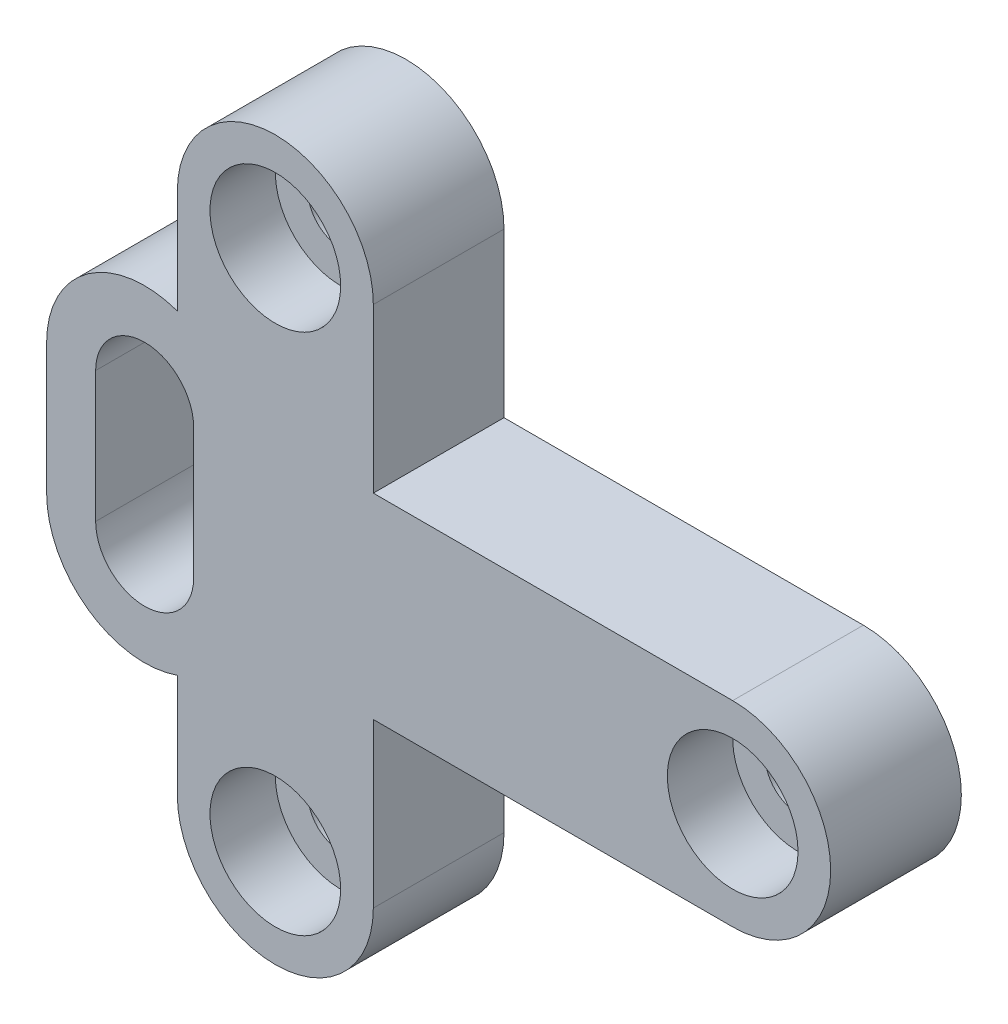
ISO-10303-21;
HEADER;
FILE_DESCRIPTION(('STEP AP214'),'2;1');
FILE_NAME('part.step','',(''),(''),'','','');
FILE_SCHEMA(('AUTOMOTIVE_DESIGN { 1 0 10303 214 1 1 1 1 }'));
ENDSEC;
DATA;
#1=APPLICATION_CONTEXT('core data for automotive mechanical design processes');
#2=APPLICATION_PROTOCOL_DEFINITION('international standard','automotive_design',2000,#1);
#3=PRODUCT_CONTEXT('',#1,'mechanical');
#4=PRODUCT('Part','Part','',(#3));
#5=PRODUCT_RELATED_PRODUCT_CATEGORY('part','',(#4));
#6=PRODUCT_DEFINITION_FORMATION('','',#4);
#7=PRODUCT_DEFINITION_CONTEXT('part definition',#1,'design');
#8=PRODUCT_DEFINITION('design','',#6,#7);
#9=PRODUCT_DEFINITION_SHAPE('','',#8);
#10=(LENGTH_UNIT() NAMED_UNIT(*) SI_UNIT(.MILLI.,.METRE.));
#11=(NAMED_UNIT(*) PLANE_ANGLE_UNIT() SI_UNIT($,.RADIAN.));
#12=(NAMED_UNIT(*) SI_UNIT($,.STERADIAN.) SOLID_ANGLE_UNIT());
#13=UNCERTAINTY_MEASURE_WITH_UNIT(LENGTH_MEASURE(1.E-05),#10,'distance_accuracy_value','');
#14=(GEOMETRIC_REPRESENTATION_CONTEXT(3) GLOBAL_UNCERTAINTY_ASSIGNED_CONTEXT((#13)) GLOBAL_UNIT_ASSIGNED_CONTEXT((#10,
#11,#12)) REPRESENTATION_CONTEXT('',''));
#15=CARTESIAN_POINT('',(0.,0.,0.));
#16=DIRECTION('',(0.,0.,1.));
#17=DIRECTION('',(1.,0.,0.));
#18=AXIS2_PLACEMENT_3D('',#15,#16,#17);
#19=CARTESIAN_POINT('',(20.,40.,20.));
#20=DIRECTION('',(0.,0.,-1.));
#21=DIRECTION('',(-1.,0.,0.));
#22=AXIS2_PLACEMENT_3D('',#19,#20,#21);
#23=CYLINDRICAL_SURFACE('',#22,5.);
#24=CARTESIAN_POINT('',(20.,40.,0.));
#25=DIRECTION('',(0.,0.,1.));
#26=DIRECTION('',(1.,0.,0.));
#27=AXIS2_PLACEMENT_3D('',#24,#25,#26);
#28=CIRCLE('',#27,5.);
#29=CARTESIAN_POINT('',(25.,40.,0.));
#30=VERTEX_POINT('',#29);
#31=EDGE_CURVE('E193',#30,#30,#28,.T.);
#32=ORIENTED_EDGE('',*,*,#31,.F.);
#33=EDGE_LOOP('',(#32));
#34=FACE_BOUND('',#33,.T.);
#35=CARTESIAN_POINT('',(20.,40.,10.));
#36=DIRECTION('',(0.,0.,1.));
#37=DIRECTION('',(1.,0.,0.));
#38=AXIS2_PLACEMENT_3D('',#35,#36,#37);
#39=CIRCLE('',#38,5.);
#40=CARTESIAN_POINT('',(25.,40.,10.));
#41=VERTEX_POINT('',#40);
#42=EDGE_CURVE('E45',#41,#41,#39,.T.);
#43=ORIENTED_EDGE('',*,*,#42,.T.);
#44=EDGE_LOOP('',(#43));
#45=FACE_BOUND('',#44,.T.);
#46=ADVANCED_FACE('F41',(#34,#45),#23,.F.);
#47=CARTESIAN_POINT('',(20.,-40.,20.));
#48=DIRECTION('',(0.,0.,-1.));
#49=DIRECTION('',(-1.,0.,0.));
#50=AXIS2_PLACEMENT_3D('',#47,#48,#49);
#51=CYLINDRICAL_SURFACE('',#50,5.);
#52=CARTESIAN_POINT('',(20.,-40.,0.));
#53=DIRECTION('',(0.,0.,1.));
#54=DIRECTION('',(1.,0.,0.));
#55=AXIS2_PLACEMENT_3D('',#52,#53,#54);
#56=CIRCLE('',#55,5.);
#57=CARTESIAN_POINT('',(25.,-40.,0.));
#58=VERTEX_POINT('',#57);
#59=EDGE_CURVE('E341',#58,#58,#56,.T.);
#60=ORIENTED_EDGE('',*,*,#59,.F.);
#61=EDGE_LOOP('',(#60));
#62=FACE_BOUND('',#61,.T.);
#63=CARTESIAN_POINT('',(20.,-40.,10.));
#64=DIRECTION('',(0.,0.,1.));
#65=DIRECTION('',(1.,0.,0.));
#66=AXIS2_PLACEMENT_3D('',#63,#64,#65);
#67=CIRCLE('',#66,5.);
#68=CARTESIAN_POINT('',(25.,-40.,10.));
#69=VERTEX_POINT('',#68);
#70=EDGE_CURVE('E328',#69,#69,#67,.T.);
#71=ORIENTED_EDGE('',*,*,#70,.T.);
#72=EDGE_LOOP('',(#71));
#73=FACE_BOUND('',#72,.T.);
#74=ADVANCED_FACE('F359',(#62,#73),#51,.F.);
#75=CARTESIAN_POINT('',(90.,0.,20.));
#76=DIRECTION('',(0.,0.,-1.));
#77=DIRECTION('',(-1.,0.,0.));
#78=AXIS2_PLACEMENT_3D('',#75,#76,#77);
#79=CYLINDRICAL_SURFACE('',#78,5.);
#80=CARTESIAN_POINT('',(90.,0.,0.));
#81=DIRECTION('',(0.,0.,1.));
#82=DIRECTION('',(1.,0.,0.));
#83=AXIS2_PLACEMENT_3D('',#80,#81,#82);
#84=CIRCLE('',#83,5.);
#85=CARTESIAN_POINT('',(95.,0.,0.));
#86=VERTEX_POINT('',#85);
#87=EDGE_CURVE('E336',#86,#86,#84,.T.);
#88=ORIENTED_EDGE('',*,*,#87,.F.);
#89=EDGE_LOOP('',(#88));
#90=FACE_BOUND('',#89,.T.);
#91=CARTESIAN_POINT('',(90.,0.,10.));
#92=DIRECTION('',(0.,0.,1.));
#93=DIRECTION('',(1.,0.,0.));
#94=AXIS2_PLACEMENT_3D('',#91,#92,#93);
#95=CIRCLE('',#94,5.);
#96=CARTESIAN_POINT('',(95.,0.,10.));
#97=VERTEX_POINT('',#96);
#98=EDGE_CURVE('E325',#97,#97,#95,.T.);
#99=ORIENTED_EDGE('',*,*,#98,.T.);
#100=EDGE_LOOP('',(#99));
#101=FACE_BOUND('',#100,.T.);
#102=ADVANCED_FACE('F364',(#90,#101),#79,.F.);
#103=CARTESIAN_POINT('',(0.,10.,20.));
#104=DIRECTION('',(0.,0.,1.));
#105=DIRECTION('',(1.,0.,0.));
#106=AXIS2_PLACEMENT_3D('',#103,#104,#105);
#107=PLANE('',#106);
#108=CARTESIAN_POINT('',(20.,40.,20.));
#109=DIRECTION('',(0.,0.,1.));
#110=DIRECTION('',(1.,0.,0.));
#111=AXIS2_PLACEMENT_3D('',#108,#109,#110);
#112=CIRCLE('',#111,10.);
#113=CARTESIAN_POINT('',(30.,40.,20.));
#114=VERTEX_POINT('',#113);
#115=EDGE_CURVE('E693',#114,#114,#112,.T.);
#116=ORIENTED_EDGE('',*,*,#115,.F.);
#117=EDGE_LOOP('',(#116));
#118=FACE_BOUND('',#117,.T.);
#119=CARTESIAN_POINT('',(20.,-40.,20.));
#120=DIRECTION('',(0.,0.,1.));
#121=DIRECTION('',(1.,0.,0.));
#122=AXIS2_PLACEMENT_3D('',#119,#120,#121);
#123=CIRCLE('',#122,10.);
#124=CARTESIAN_POINT('',(30.,-40.,20.));
#125=VERTEX_POINT('',#124);
#126=EDGE_CURVE('E703',#125,#125,#123,.T.);
#127=ORIENTED_EDGE('',*,*,#126,.F.);
#128=EDGE_LOOP('',(#127));
#129=FACE_BOUND('',#128,.T.);
#130=CARTESIAN_POINT('',(90.,0.,20.));
#131=DIRECTION('',(0.,0.,1.));
#132=DIRECTION('',(1.,0.,0.));
#133=AXIS2_PLACEMENT_3D('',#130,#131,#132);
#134=CIRCLE('',#133,9.99999999999999);
#135=CARTESIAN_POINT('',(100.,0.,20.));
#136=VERTEX_POINT('',#135);
#137=EDGE_CURVE('E349',#136,#136,#134,.T.);
#138=ORIENTED_EDGE('',*,*,#137,.F.);
#139=EDGE_LOOP('',(#138));
#140=FACE_BOUND('',#139,.T.);
#141=DIRECTION('',(0.,-1.,0.));
#142=VECTOR('',#141,1.);
#143=CARTESIAN_POINT('',(-7.5,10.,20.));
#144=LINE('',#143,#142);
#145=CARTESIAN_POINT('',(-7.5,10.,20.));
#146=VERTEX_POINT('',#145);
#147=CARTESIAN_POINT('',(-7.49999999999999,-10.,20.));
#148=VERTEX_POINT('',#147);
#149=EDGE_CURVE('E166',#146,#148,#144,.T.);
#150=ORIENTED_EDGE('',*,*,#149,.F.);
#151=CARTESIAN_POINT('',(0.,10.,20.));
#152=DIRECTION('',(0.,0.,1.));
#153=DIRECTION('',(1.,0.,0.));
#154=AXIS2_PLACEMENT_3D('',#151,#152,#153);
#155=CIRCLE('',#154,7.5);
#156=CARTESIAN_POINT('',(7.49999999999999,10.,20.));
#157=VERTEX_POINT('',#156);
#158=EDGE_CURVE('E157',#157,#146,#155,.T.);
#159=ORIENTED_EDGE('',*,*,#158,.F.);
#160=DIRECTION('',(0.,1.,0.));
#161=VECTOR('',#160,1.);
#162=CARTESIAN_POINT('',(7.49999999999999,10.,20.));
#163=LINE('',#162,#161);
#164=CARTESIAN_POINT('',(7.5,-10.,20.));
#165=VERTEX_POINT('',#164);
#166=EDGE_CURVE('E185',#165,#157,#163,.T.);
#167=ORIENTED_EDGE('',*,*,#166,.F.);
#168=CARTESIAN_POINT('',(0.,-10.,20.));
#169=DIRECTION('',(0.,0.,1.));
#170=DIRECTION('',(1.,0.,0.));
#171=AXIS2_PLACEMENT_3D('',#168,#169,#170);
#172=CIRCLE('',#171,7.5);
#173=EDGE_CURVE('E181',#148,#165,#172,.T.);
#174=ORIENTED_EDGE('',*,*,#173,.F.);
#175=EDGE_LOOP('',(#150,#159,#167,#174));
#176=FACE_BOUND('',#175,.T.);
#177=CARTESIAN_POINT('',(0.,10.,20.));
#178=DIRECTION('',(0.,0.,1.));
#179=DIRECTION('',(1.,0.,0.));
#180=AXIS2_PLACEMENT_3D('',#177,#178,#179);
#181=CIRCLE('',#180,15.);
#182=CARTESIAN_POINT('',(4.99999999999997,24.142135623731,20.));
#183=VERTEX_POINT('',#182);
#184=CARTESIAN_POINT('',(-15.,9.99999999999999,20.));
#185=VERTEX_POINT('',#184);
#186=EDGE_CURVE('E209',#183,#185,#181,.T.);
#187=ORIENTED_EDGE('',*,*,#186,.T.);
#188=DIRECTION('',(0.,-1.,0.));
#189=VECTOR('',#188,1.);
#190=CARTESIAN_POINT('',(-15.,9.99999999999999,20.));
#191=LINE('',#190,#189);
#192=CARTESIAN_POINT('',(-15.,-10.,20.));
#193=VERTEX_POINT('',#192);
#194=EDGE_CURVE('E213',#185,#193,#191,.T.);
#195=ORIENTED_EDGE('',*,*,#194,.T.);
#196=CARTESIAN_POINT('',(0.,-10.,20.));
#197=DIRECTION('',(0.,0.,1.));
#198=DIRECTION('',(1.,0.,0.));
#199=AXIS2_PLACEMENT_3D('',#196,#197,#198);
#200=CIRCLE('',#199,15.);
#201=CARTESIAN_POINT('',(4.99999999999998,-24.142135623731,20.));
#202=VERTEX_POINT('',#201);
#203=EDGE_CURVE('E217',#193,#202,#200,.T.);
#204=ORIENTED_EDGE('',*,*,#203,.T.);
#205=DIRECTION('',(0.,-1.,0.));
#206=VECTOR('',#205,1.);
#207=CARTESIAN_POINT('',(4.99999999999999,-24.142135623731,20.));
#208=LINE('',#207,#206);
#209=CARTESIAN_POINT('',(4.99999999999999,-40.,20.));
#210=VERTEX_POINT('',#209);
#211=EDGE_CURVE('E220',#202,#210,#208,.T.);
#212=ORIENTED_EDGE('',*,*,#211,.T.);
#213=CARTESIAN_POINT('',(20.,-40.,20.));
#214=DIRECTION('',(0.,0.,1.));
#215=DIRECTION('',(1.,0.,0.));
#216=AXIS2_PLACEMENT_3D('',#213,#214,#215);
#217=CIRCLE('',#216,15.);
#218=CARTESIAN_POINT('',(35.,-40.,20.));
#219=VERTEX_POINT('',#218);
#220=EDGE_CURVE('E223',#210,#219,#217,.T.);
#221=ORIENTED_EDGE('',*,*,#220,.T.);
#222=DIRECTION('',(0.,1.,0.));
#223=VECTOR('',#222,1.);
#224=CARTESIAN_POINT('',(35.,-15.,20.));
#225=LINE('',#224,#223);
#226=CARTESIAN_POINT('',(35.,-15.,20.));
#227=VERTEX_POINT('',#226);
#228=EDGE_CURVE('E226',#219,#227,#225,.T.);
#229=ORIENTED_EDGE('',*,*,#228,.T.);
#230=DIRECTION('',(1.,0.,0.));
#231=VECTOR('',#230,1.);
#232=CARTESIAN_POINT('',(35.,-15.,20.));
#233=LINE('',#232,#231);
#234=CARTESIAN_POINT('',(90.,-15.,20.));
#235=VERTEX_POINT('',#234);
#236=EDGE_CURVE('E229',#227,#235,#233,.T.);
#237=ORIENTED_EDGE('',*,*,#236,.T.);
#238=CARTESIAN_POINT('',(90.,0.,20.));
#239=DIRECTION('',(0.,0.,1.));
#240=DIRECTION('',(1.,0.,0.));
#241=AXIS2_PLACEMENT_3D('',#238,#239,#240);
#242=CIRCLE('',#241,15.);
#243=CARTESIAN_POINT('',(90.,15.,20.));
#244=VERTEX_POINT('',#243);
#245=EDGE_CURVE('E232',#235,#244,#242,.T.);
#246=ORIENTED_EDGE('',*,*,#245,.T.);
#247=DIRECTION('',(-1.,0.,0.));
#248=VECTOR('',#247,1.);
#249=CARTESIAN_POINT('',(35.,15.,20.));
#250=LINE('',#249,#248);
#251=CARTESIAN_POINT('',(35.,15.,20.));
#252=VERTEX_POINT('',#251);
#253=EDGE_CURVE('E235',#244,#252,#250,.T.);
#254=ORIENTED_EDGE('',*,*,#253,.T.);
#255=DIRECTION('',(0.,1.,0.));
#256=VECTOR('',#255,1.);
#257=CARTESIAN_POINT('',(35.,40.,20.));
#258=LINE('',#257,#256);
#259=CARTESIAN_POINT('',(35.,40.,20.));
#260=VERTEX_POINT('',#259);
#261=EDGE_CURVE('E238',#252,#260,#258,.T.);
#262=ORIENTED_EDGE('',*,*,#261,.T.);
#263=CARTESIAN_POINT('',(20.,40.,20.));
#264=DIRECTION('',(0.,0.,1.));
#265=DIRECTION('',(1.,0.,0.));
#266=AXIS2_PLACEMENT_3D('',#263,#264,#265);
#267=CIRCLE('',#266,15.);
#268=CARTESIAN_POINT('',(4.99999999999997,40.,20.));
#269=VERTEX_POINT('',#268);
#270=EDGE_CURVE('E241',#260,#269,#267,.T.);
#271=ORIENTED_EDGE('',*,*,#270,.T.);
#272=DIRECTION('',(0.,-1.,0.));
#273=VECTOR('',#272,1.);
#274=CARTESIAN_POINT('',(4.99999999999997,40.,20.));
#275=LINE('',#274,#273);
#276=EDGE_CURVE('E244',#269,#183,#275,.T.);
#277=ORIENTED_EDGE('',*,*,#276,.T.);
#278=EDGE_LOOP('',(#187,#195,#204,#212,#221,#229,#237,#246,#254,#262,#271,#277));
#279=FACE_BOUND('',#278,.T.);
#280=ADVANCED_FACE('F179',(#118,#129,#140,#176,#279),#107,.T.);
#281=CARTESIAN_POINT('',(0.,10.,0.));
#282=DIRECTION('',(0.,0.,1.));
#283=DIRECTION('',(1.,0.,0.));
#284=AXIS2_PLACEMENT_3D('',#281,#282,#283);
#285=PLANE('',#284);
#286=CARTESIAN_POINT('',(0.,10.,0.));
#287=DIRECTION('',(0.,0.,1.));
#288=DIRECTION('',(1.,0.,0.));
#289=AXIS2_PLACEMENT_3D('',#286,#287,#288);
#290=CIRCLE('',#289,15.);
#291=CARTESIAN_POINT('',(4.99999999999997,24.142135623731,0.));
#292=VERTEX_POINT('',#291);
#293=CARTESIAN_POINT('',(-15.,9.99999999999999,0.));
#294=VERTEX_POINT('',#293);
#295=EDGE_CURVE('E175',#292,#294,#290,.T.);
#296=ORIENTED_EDGE('',*,*,#295,.F.);
#297=DIRECTION('',(0.,-1.,0.));
#298=VECTOR('',#297,1.);
#299=CARTESIAN_POINT('',(4.99999999999997,40.,0.));
#300=LINE('',#299,#298);
#301=CARTESIAN_POINT('',(4.99999999999997,40.,0.));
#302=VERTEX_POINT('',#301);
#303=EDGE_CURVE('E214',#302,#292,#300,.T.);
#304=ORIENTED_EDGE('',*,*,#303,.F.);
#305=CARTESIAN_POINT('',(20.,40.,0.));
#306=DIRECTION('',(0.,0.,1.));
#307=DIRECTION('',(1.,0.,0.));
#308=AXIS2_PLACEMENT_3D('',#305,#306,#307);
#309=CIRCLE('',#308,15.);
#310=CARTESIAN_POINT('',(35.,40.,0.));
#311=VERTEX_POINT('',#310);
#312=EDGE_CURVE('E278',#311,#302,#309,.T.);
#313=ORIENTED_EDGE('',*,*,#312,.F.);
#314=DIRECTION('',(0.,1.,0.));
#315=VECTOR('',#314,1.);
#316=CARTESIAN_POINT('',(35.,40.,0.));
#317=LINE('',#316,#315);
#318=CARTESIAN_POINT('',(35.,15.,0.));
#319=VERTEX_POINT('',#318);
#320=EDGE_CURVE('E275',#319,#311,#317,.T.);
#321=ORIENTED_EDGE('',*,*,#320,.F.);
#322=DIRECTION('',(-1.,0.,0.));
#323=VECTOR('',#322,1.);
#324=CARTESIAN_POINT('',(35.,15.,0.));
#325=LINE('',#324,#323);
#326=CARTESIAN_POINT('',(90.,15.,0.));
#327=VERTEX_POINT('',#326);
#328=EDGE_CURVE('E272',#327,#319,#325,.T.);
#329=ORIENTED_EDGE('',*,*,#328,.F.);
#330=CARTESIAN_POINT('',(90.,0.,0.));
#331=DIRECTION('',(0.,0.,1.));
#332=DIRECTION('',(1.,0.,0.));
#333=AXIS2_PLACEMENT_3D('',#330,#331,#332);
#334=CIRCLE('',#333,15.);
#335=CARTESIAN_POINT('',(90.,-15.,0.));
#336=VERTEX_POINT('',#335);
#337=EDGE_CURVE('E269',#336,#327,#334,.T.);
#338=ORIENTED_EDGE('',*,*,#337,.F.);
#339=DIRECTION('',(1.,0.,0.));
#340=VECTOR('',#339,1.);
#341=CARTESIAN_POINT('',(35.,-15.,0.));
#342=LINE('',#341,#340);
#343=CARTESIAN_POINT('',(35.,-15.,0.));
#344=VERTEX_POINT('',#343);
#345=EDGE_CURVE('E266',#344,#336,#342,.T.);
#346=ORIENTED_EDGE('',*,*,#345,.F.);
#347=DIRECTION('',(0.,1.,0.));
#348=VECTOR('',#347,1.);
#349=CARTESIAN_POINT('',(35.,-15.,0.));
#350=LINE('',#349,#348);
#351=CARTESIAN_POINT('',(35.,-40.,0.));
#352=VERTEX_POINT('',#351);
#353=EDGE_CURVE('E263',#352,#344,#350,.T.);
#354=ORIENTED_EDGE('',*,*,#353,.F.);
#355=CARTESIAN_POINT('',(20.,-40.,0.));
#356=DIRECTION('',(0.,0.,1.));
#357=DIRECTION('',(1.,0.,0.));
#358=AXIS2_PLACEMENT_3D('',#355,#356,#357);
#359=CIRCLE('',#358,15.);
#360=CARTESIAN_POINT('',(4.99999999999999,-40.,0.));
#361=VERTEX_POINT('',#360);
#362=EDGE_CURVE('E260',#361,#352,#359,.T.);
#363=ORIENTED_EDGE('',*,*,#362,.F.);
#364=DIRECTION('',(0.,-1.,0.));
#365=VECTOR('',#364,1.);
#366=CARTESIAN_POINT('',(4.99999999999999,-24.142135623731,0.));
#367=LINE('',#366,#365);
#368=CARTESIAN_POINT('',(4.99999999999998,-24.142135623731,0.));
#369=VERTEX_POINT('',#368);
#370=EDGE_CURVE('E257',#369,#361,#367,.T.);
#371=ORIENTED_EDGE('',*,*,#370,.F.);
#372=CARTESIAN_POINT('',(0.,-10.,0.));
#373=DIRECTION('',(0.,0.,1.));
#374=DIRECTION('',(1.,0.,0.));
#375=AXIS2_PLACEMENT_3D('',#372,#373,#374);
#376=CIRCLE('',#375,15.);
#377=CARTESIAN_POINT('',(-15.,-10.,0.));
#378=VERTEX_POINT('',#377);
#379=EDGE_CURVE('E254',#378,#369,#376,.T.);
#380=ORIENTED_EDGE('',*,*,#379,.F.);
#381=DIRECTION('',(0.,-1.,0.));
#382=VECTOR('',#381,1.);
#383=CARTESIAN_POINT('',(-15.,9.99999999999999,0.));
#384=LINE('',#383,#382);
#385=EDGE_CURVE('E251',#294,#378,#384,.T.);
#386=ORIENTED_EDGE('',*,*,#385,.F.);
#387=EDGE_LOOP('',(#296,#304,#313,#321,#329,#338,#346,#354,#363,#371,#380,#386));
#388=FACE_BOUND('',#387,.T.);
#389=CARTESIAN_POINT('',(0.,10.,0.));
#390=DIRECTION('',(0.,0.,1.));
#391=DIRECTION('',(1.,0.,0.));
#392=AXIS2_PLACEMENT_3D('',#389,#390,#391);
#393=CIRCLE('',#392,7.5);
#394=CARTESIAN_POINT('',(7.49999999999999,10.,0.));
#395=VERTEX_POINT('',#394);
#396=CARTESIAN_POINT('',(-7.5,10.,0.));
#397=VERTEX_POINT('',#396);
#398=EDGE_CURVE('E67',#395,#397,#393,.T.);
#399=ORIENTED_EDGE('',*,*,#398,.T.);
#400=DIRECTION('',(0.,-1.,0.));
#401=VECTOR('',#400,1.);
#402=CARTESIAN_POINT('',(-7.5,10.,0.));
#403=LINE('',#402,#401);
#404=CARTESIAN_POINT('',(-7.49999999999999,-10.,0.));
#405=VERTEX_POINT('',#404);
#406=EDGE_CURVE('E173',#397,#405,#403,.T.);
#407=ORIENTED_EDGE('',*,*,#406,.T.);
#408=CARTESIAN_POINT('',(0.,-10.,0.));
#409=DIRECTION('',(0.,0.,1.));
#410=DIRECTION('',(1.,0.,0.));
#411=AXIS2_PLACEMENT_3D('',#408,#409,#410);
#412=CIRCLE('',#411,7.5);
#413=CARTESIAN_POINT('',(7.5,-10.,0.));
#414=VERTEX_POINT('',#413);
#415=EDGE_CURVE('E196',#405,#414,#412,.T.);
#416=ORIENTED_EDGE('',*,*,#415,.T.);
#417=DIRECTION('',(0.,1.,0.));
#418=VECTOR('',#417,1.);
#419=CARTESIAN_POINT('',(7.49999999999999,10.,0.));
#420=LINE('',#419,#418);
#421=EDGE_CURVE('E167',#414,#395,#420,.T.);
#422=ORIENTED_EDGE('',*,*,#421,.T.);
#423=EDGE_LOOP('',(#399,#407,#416,#422));
#424=FACE_BOUND('',#423,.T.);
#425=ORIENTED_EDGE('',*,*,#31,.T.);
#426=EDGE_LOOP('',(#425));
#427=FACE_BOUND('',#426,.T.);
#428=ORIENTED_EDGE('',*,*,#59,.T.);
#429=EDGE_LOOP('',(#428));
#430=FACE_BOUND('',#429,.T.);
#431=ORIENTED_EDGE('',*,*,#87,.T.);
#432=EDGE_LOOP('',(#431));
#433=FACE_BOUND('',#432,.T.);
#434=ADVANCED_FACE('F355',(#388,#424,#427,#430,#433),#285,.F.);
#435=CARTESIAN_POINT('',(0.,10.,20.));
#436=DIRECTION('',(0.,0.,-1.));
#437=DIRECTION('',(-1.,0.,0.));
#438=AXIS2_PLACEMENT_3D('',#435,#436,#437);
#439=CYLINDRICAL_SURFACE('',#438,15.);
#440=ORIENTED_EDGE('',*,*,#295,.T.);
#441=DIRECTION('',(0.,0.,-1.));
#442=VECTOR('',#441,1.);
#443=CARTESIAN_POINT('',(-15.,9.99999999999999,20.));
#444=LINE('',#443,#442);
#445=EDGE_CURVE('E11',#185,#294,#444,.T.);
#446=ORIENTED_EDGE('',*,*,#445,.F.);
#447=ORIENTED_EDGE('',*,*,#186,.F.);
#448=DIRECTION('',(0.,0.,-1.));
#449=VECTOR('',#448,1.);
#450=CARTESIAN_POINT('',(4.99999999999997,24.142135623731,20.));
#451=LINE('',#450,#449);
#452=EDGE_CURVE('E247',#183,#292,#451,.T.);
#453=ORIENTED_EDGE('',*,*,#452,.T.);
#454=EDGE_LOOP('',(#440,#446,#447,#453));
#455=FACE_BOUND('',#454,.T.);
#456=ADVANCED_FACE('F43',(#455),#439,.T.);
#457=CARTESIAN_POINT('',(-15.,9.99999999999999,20.));
#458=DIRECTION('',(1.,0.,0.));
#459=DIRECTION('',(0.,1.,0.));
#460=AXIS2_PLACEMENT_3D('',#457,#458,#459);
#461=PLANE('',#460);
#462=ORIENTED_EDGE('',*,*,#385,.T.);
#463=DIRECTION('',(0.,0.,-1.));
#464=VECTOR('',#463,1.);
#465=CARTESIAN_POINT('',(-15.,-10.,20.));
#466=LINE('',#465,#464);
#467=EDGE_CURVE('E51',#193,#378,#466,.T.);
#468=ORIENTED_EDGE('',*,*,#467,.F.);
#469=ORIENTED_EDGE('',*,*,#194,.F.);
#470=ORIENTED_EDGE('',*,*,#445,.T.);
#471=EDGE_LOOP('',(#462,#468,#469,#470));
#472=FACE_BOUND('',#471,.T.);
#473=ADVANCED_FACE('F425',(#472),#461,.F.);
#474=CARTESIAN_POINT('',(0.,-10.,20.));
#475=DIRECTION('',(0.,0.,-1.));
#476=DIRECTION('',(-1.,0.,0.));
#477=AXIS2_PLACEMENT_3D('',#474,#475,#476);
#478=CYLINDRICAL_SURFACE('',#477,15.);
#479=ORIENTED_EDGE('',*,*,#379,.T.);
#480=DIRECTION('',(0.,0.,-1.));
#481=VECTOR('',#480,1.);
#482=CARTESIAN_POINT('',(4.99999999999998,-24.142135623731,20.));
#483=LINE('',#482,#481);
#484=EDGE_CURVE('E318',#202,#369,#483,.T.);
#485=ORIENTED_EDGE('',*,*,#484,.F.);
#486=ORIENTED_EDGE('',*,*,#203,.F.);
#487=ORIENTED_EDGE('',*,*,#467,.T.);
#488=EDGE_LOOP('',(#479,#485,#486,#487));
#489=FACE_BOUND('',#488,.T.);
#490=ADVANCED_FACE('F422',(#489),#478,.T.);
#491=CARTESIAN_POINT('',(4.99999999999999,-24.142135623731,20.));
#492=DIRECTION('',(1.,0.,0.));
#493=DIRECTION('',(0.,1.,0.));
#494=AXIS2_PLACEMENT_3D('',#491,#492,#493);
#495=PLANE('',#494);
#496=ORIENTED_EDGE('',*,*,#370,.T.);
#497=DIRECTION('',(0.,0.,-1.));
#498=VECTOR('',#497,1.);
#499=CARTESIAN_POINT('',(4.99999999999999,-40.,20.));
#500=LINE('',#499,#498);
#501=EDGE_CURVE('E314',#210,#361,#500,.T.);
#502=ORIENTED_EDGE('',*,*,#501,.F.);
#503=ORIENTED_EDGE('',*,*,#211,.F.);
#504=ORIENTED_EDGE('',*,*,#484,.T.);
#505=EDGE_LOOP('',(#496,#502,#503,#504));
#506=FACE_BOUND('',#505,.T.);
#507=ADVANCED_FACE('F418',(#506),#495,.F.);
#508=CARTESIAN_POINT('',(20.,-40.,20.));
#509=DIRECTION('',(0.,0.,-1.));
#510=DIRECTION('',(-1.,0.,0.));
#511=AXIS2_PLACEMENT_3D('',#508,#509,#510);
#512=CYLINDRICAL_SURFACE('',#511,15.);
#513=ORIENTED_EDGE('',*,*,#362,.T.);
#514=DIRECTION('',(0.,0.,-1.));
#515=VECTOR('',#514,1.);
#516=CARTESIAN_POINT('',(35.,-40.,20.));
#517=LINE('',#516,#515);
#518=EDGE_CURVE('E310',#219,#352,#517,.T.);
#519=ORIENTED_EDGE('',*,*,#518,.F.);
#520=ORIENTED_EDGE('',*,*,#220,.F.);
#521=ORIENTED_EDGE('',*,*,#501,.T.);
#522=EDGE_LOOP('',(#513,#519,#520,#521));
#523=FACE_BOUND('',#522,.T.);
#524=ADVANCED_FACE('F414',(#523),#512,.T.);
#525=CARTESIAN_POINT('',(35.,-15.,20.));
#526=DIRECTION('',(-1.,0.,0.));
#527=DIRECTION('',(0.,-1.,0.));
#528=AXIS2_PLACEMENT_3D('',#525,#526,#527);
#529=PLANE('',#528);
#530=ORIENTED_EDGE('',*,*,#353,.T.);
#531=DIRECTION('',(0.,0.,-1.));
#532=VECTOR('',#531,1.);
#533=CARTESIAN_POINT('',(35.,-15.,20.));
#534=LINE('',#533,#532);
#535=EDGE_CURVE('E306',#227,#344,#534,.T.);
#536=ORIENTED_EDGE('',*,*,#535,.F.);
#537=ORIENTED_EDGE('',*,*,#228,.F.);
#538=ORIENTED_EDGE('',*,*,#518,.T.);
#539=EDGE_LOOP('',(#530,#536,#537,#538));
#540=FACE_BOUND('',#539,.T.);
#541=ADVANCED_FACE('F410',(#540),#529,.F.);
#542=CARTESIAN_POINT('',(35.,-15.,20.));
#543=DIRECTION('',(0.,1.,0.));
#544=DIRECTION('',(0.,0.,1.));
#545=AXIS2_PLACEMENT_3D('',#542,#543,#544);
#546=PLANE('',#545);
#547=ORIENTED_EDGE('',*,*,#345,.T.);
#548=DIRECTION('',(0.,0.,-1.));
#549=VECTOR('',#548,1.);
#550=CARTESIAN_POINT('',(90.,-15.,20.));
#551=LINE('',#550,#549);
#552=EDGE_CURVE('E302',#235,#336,#551,.T.);
#553=ORIENTED_EDGE('',*,*,#552,.F.);
#554=ORIENTED_EDGE('',*,*,#236,.F.);
#555=ORIENTED_EDGE('',*,*,#535,.T.);
#556=EDGE_LOOP('',(#547,#553,#554,#555));
#557=FACE_BOUND('',#556,.T.);
#558=ADVANCED_FACE('F406',(#557),#546,.F.);
#559=CARTESIAN_POINT('',(90.,0.,20.));
#560=DIRECTION('',(0.,0.,-1.));
#561=DIRECTION('',(-1.,0.,0.));
#562=AXIS2_PLACEMENT_3D('',#559,#560,#561);
#563=CYLINDRICAL_SURFACE('',#562,15.);
#564=ORIENTED_EDGE('',*,*,#337,.T.);
#565=DIRECTION('',(0.,0.,-1.));
#566=VECTOR('',#565,1.);
#567=CARTESIAN_POINT('',(90.,15.,20.));
#568=LINE('',#567,#566);
#569=EDGE_CURVE('E298',#244,#327,#568,.T.);
#570=ORIENTED_EDGE('',*,*,#569,.F.);
#571=ORIENTED_EDGE('',*,*,#245,.F.);
#572=ORIENTED_EDGE('',*,*,#552,.T.);
#573=EDGE_LOOP('',(#564,#570,#571,#572));
#574=FACE_BOUND('',#573,.T.);
#575=ADVANCED_FACE('F402',(#574),#563,.T.);
#576=CARTESIAN_POINT('',(35.,15.,20.));
#577=DIRECTION('',(0.,-1.,0.));
#578=DIRECTION('',(0.,0.,-1.));
#579=AXIS2_PLACEMENT_3D('',#576,#577,#578);
#580=PLANE('',#579);
#581=ORIENTED_EDGE('',*,*,#328,.T.);
#582=DIRECTION('',(0.,0.,-1.));
#583=VECTOR('',#582,1.);
#584=CARTESIAN_POINT('',(35.,15.,20.));
#585=LINE('',#584,#583);
#586=EDGE_CURVE('E294',#252,#319,#585,.T.);
#587=ORIENTED_EDGE('',*,*,#586,.F.);
#588=ORIENTED_EDGE('',*,*,#253,.F.);
#589=ORIENTED_EDGE('',*,*,#569,.T.);
#590=EDGE_LOOP('',(#581,#587,#588,#589));
#591=FACE_BOUND('',#590,.T.);
#592=ADVANCED_FACE('F398',(#591),#580,.F.);
#593=CARTESIAN_POINT('',(35.,40.,20.));
#594=DIRECTION('',(-1.,0.,0.));
#595=DIRECTION('',(0.,-1.,0.));
#596=AXIS2_PLACEMENT_3D('',#593,#594,#595);
#597=PLANE('',#596);
#598=ORIENTED_EDGE('',*,*,#320,.T.);
#599=DIRECTION('',(0.,0.,-1.));
#600=VECTOR('',#599,1.);
#601=CARTESIAN_POINT('',(35.,40.,20.));
#602=LINE('',#601,#600);
#603=EDGE_CURVE('E290',#260,#311,#602,.T.);
#604=ORIENTED_EDGE('',*,*,#603,.F.);
#605=ORIENTED_EDGE('',*,*,#261,.F.);
#606=ORIENTED_EDGE('',*,*,#586,.T.);
#607=EDGE_LOOP('',(#598,#604,#605,#606));
#608=FACE_BOUND('',#607,.T.);
#609=ADVANCED_FACE('F394',(#608),#597,.F.);
#610=CARTESIAN_POINT('',(20.,40.,20.));
#611=DIRECTION('',(0.,0.,-1.));
#612=DIRECTION('',(-1.,0.,0.));
#613=AXIS2_PLACEMENT_3D('',#610,#611,#612);
#614=CYLINDRICAL_SURFACE('',#613,15.);
#615=ORIENTED_EDGE('',*,*,#312,.T.);
#616=DIRECTION('',(0.,0.,-1.));
#617=VECTOR('',#616,1.);
#618=CARTESIAN_POINT('',(4.99999999999997,40.,20.));
#619=LINE('',#618,#617);
#620=EDGE_CURVE('E286',#269,#302,#619,.T.);
#621=ORIENTED_EDGE('',*,*,#620,.F.);
#622=ORIENTED_EDGE('',*,*,#270,.F.);
#623=ORIENTED_EDGE('',*,*,#603,.T.);
#624=EDGE_LOOP('',(#615,#621,#622,#623));
#625=FACE_BOUND('',#624,.T.);
#626=ADVANCED_FACE('F390',(#625),#614,.T.);
#627=CARTESIAN_POINT('',(4.99999999999997,40.,20.));
#628=DIRECTION('',(1.,0.,0.));
#629=DIRECTION('',(0.,1.,0.));
#630=AXIS2_PLACEMENT_3D('',#627,#628,#629);
#631=PLANE('',#630);
#632=ORIENTED_EDGE('',*,*,#303,.T.);
#633=ORIENTED_EDGE('',*,*,#452,.F.);
#634=ORIENTED_EDGE('',*,*,#276,.F.);
#635=ORIENTED_EDGE('',*,*,#620,.T.);
#636=EDGE_LOOP('',(#632,#633,#634,#635));
#637=FACE_BOUND('',#636,.T.);
#638=ADVANCED_FACE('F381',(#637),#631,.F.);
#639=CARTESIAN_POINT('',(0.,10.,20.));
#640=DIRECTION('',(0.,0.,-1.));
#641=DIRECTION('',(-1.,0.,0.));
#642=AXIS2_PLACEMENT_3D('',#639,#640,#641);
#643=CYLINDRICAL_SURFACE('',#642,7.5);
#644=ORIENTED_EDGE('',*,*,#398,.F.);
#645=DIRECTION('',(0.,0.,-1.));
#646=VECTOR('',#645,1.);
#647=CARTESIAN_POINT('',(7.49999999999999,10.,20.));
#648=LINE('',#647,#646);
#649=EDGE_CURVE('E161',#157,#395,#648,.T.);
#650=ORIENTED_EDGE('',*,*,#649,.F.);
#651=ORIENTED_EDGE('',*,*,#158,.T.);
#652=DIRECTION('',(0.,0.,-1.));
#653=VECTOR('',#652,1.);
#654=CARTESIAN_POINT('',(-7.5,10.,20.));
#655=LINE('',#654,#653);
#656=EDGE_CURVE('E160',#146,#397,#655,.T.);
#657=ORIENTED_EDGE('',*,*,#656,.T.);
#658=EDGE_LOOP('',(#644,#650,#651,#657));
#659=FACE_BOUND('',#658,.T.);
#660=ADVANCED_FACE('F159',(#659),#643,.F.);
#661=CARTESIAN_POINT('',(-7.5,10.,20.));
#662=DIRECTION('',(1.,0.,0.));
#663=DIRECTION('',(0.,1.,0.));
#664=AXIS2_PLACEMENT_3D('',#661,#662,#663);
#665=PLANE('',#664);
#666=ORIENTED_EDGE('',*,*,#406,.F.);
#667=ORIENTED_EDGE('',*,*,#656,.F.);
#668=ORIENTED_EDGE('',*,*,#149,.T.);
#669=DIRECTION('',(0.,0.,-1.));
#670=VECTOR('',#669,1.);
#671=CARTESIAN_POINT('',(-7.49999999999999,-10.,20.));
#672=LINE('',#671,#670);
#673=EDGE_CURVE('E176',#148,#405,#672,.T.);
#674=ORIENTED_EDGE('',*,*,#673,.T.);
#675=EDGE_LOOP('',(#666,#667,#668,#674));
#676=FACE_BOUND('',#675,.T.);
#677=ADVANCED_FACE('F170',(#676),#665,.T.);
#678=CARTESIAN_POINT('',(0.,-10.,20.));
#679=DIRECTION('',(0.,0.,-1.));
#680=DIRECTION('',(-1.,0.,0.));
#681=AXIS2_PLACEMENT_3D('',#678,#679,#680);
#682=CYLINDRICAL_SURFACE('',#681,7.5);
#683=ORIENTED_EDGE('',*,*,#415,.F.);
#684=ORIENTED_EDGE('',*,*,#673,.F.);
#685=ORIENTED_EDGE('',*,*,#173,.T.);
#686=DIRECTION('',(0.,0.,-1.));
#687=VECTOR('',#686,1.);
#688=CARTESIAN_POINT('',(7.5,-10.,20.));
#689=LINE('',#688,#687);
#690=EDGE_CURVE('E59',#165,#414,#689,.T.);
#691=ORIENTED_EDGE('',*,*,#690,.T.);
#692=EDGE_LOOP('',(#683,#684,#685,#691));
#693=FACE_BOUND('',#692,.T.);
#694=ADVANCED_FACE('F373',(#693),#682,.F.);
#695=CARTESIAN_POINT('',(7.49999999999999,10.,20.));
#696=DIRECTION('',(-1.,0.,0.));
#697=DIRECTION('',(0.,-1.,0.));
#698=AXIS2_PLACEMENT_3D('',#695,#696,#697);
#699=PLANE('',#698);
#700=ORIENTED_EDGE('',*,*,#421,.F.);
#701=ORIENTED_EDGE('',*,*,#690,.F.);
#702=ORIENTED_EDGE('',*,*,#166,.T.);
#703=ORIENTED_EDGE('',*,*,#649,.T.);
#704=EDGE_LOOP('',(#700,#701,#702,#703));
#705=FACE_BOUND('',#704,.T.);
#706=ADVANCED_FACE('F369',(#705),#699,.T.);
#707=CARTESIAN_POINT('',(90.,0.,10.));
#708=DIRECTION('',(0.,0.,1.));
#709=DIRECTION('',(1.,0.,0.));
#710=AXIS2_PLACEMENT_3D('',#707,#708,#709);
#711=CYLINDRICAL_SURFACE('',#710,9.99999999999999);
#712=CARTESIAN_POINT('',(90.,0.,10.));
#713=DIRECTION('',(0.,0.,1.));
#714=DIRECTION('',(1.,0.,0.));
#715=AXIS2_PLACEMENT_3D('',#712,#713,#714);
#716=CIRCLE('',#715,9.99999999999999);
#717=CARTESIAN_POINT('',(100.,0.,10.));
#718=VERTEX_POINT('',#717);
#719=EDGE_CURVE('E706',#718,#718,#716,.T.);
#720=ORIENTED_EDGE('',*,*,#719,.F.);
#721=EDGE_LOOP('',(#720));
#722=FACE_BOUND('',#721,.T.);
#723=ORIENTED_EDGE('',*,*,#137,.T.);
#724=EDGE_LOOP('',(#723));
#725=FACE_BOUND('',#724,.T.);
#726=ADVANCED_FACE('F372',(#722,#725),#711,.F.);
#727=CARTESIAN_POINT('',(90.,0.,10.));
#728=DIRECTION('',(0.,0.,1.));
#729=DIRECTION('',(1.,0.,0.));
#730=AXIS2_PLACEMENT_3D('',#727,#728,#729);
#731=PLANE('',#730);
#732=ORIENTED_EDGE('',*,*,#98,.F.);
#733=EDGE_LOOP('',(#732));
#734=FACE_BOUND('',#733,.T.);
#735=ORIENTED_EDGE('',*,*,#719,.T.);
#736=EDGE_LOOP('',(#735));
#737=FACE_BOUND('',#736,.T.);
#738=ADVANCED_FACE('F508',(#734,#737),#731,.T.);
#739=CARTESIAN_POINT('',(20.,-40.,10.));
#740=DIRECTION('',(0.,0.,1.));
#741=DIRECTION('',(1.,0.,0.));
#742=AXIS2_PLACEMENT_3D('',#739,#740,#741);
#743=CYLINDRICAL_SURFACE('',#742,10.);
#744=CARTESIAN_POINT('',(20.,-40.,10.));
#745=DIRECTION('',(0.,0.,1.));
#746=DIRECTION('',(1.,0.,0.));
#747=AXIS2_PLACEMENT_3D('',#744,#745,#746);
#748=CIRCLE('',#747,10.);
#749=CARTESIAN_POINT('',(30.,-40.,10.));
#750=VERTEX_POINT('',#749);
#751=EDGE_CURVE('E697',#750,#750,#748,.T.);
#752=ORIENTED_EDGE('',*,*,#751,.F.);
#753=EDGE_LOOP('',(#752));
#754=FACE_BOUND('',#753,.T.);
#755=ORIENTED_EDGE('',*,*,#126,.T.);
#756=EDGE_LOOP('',(#755));
#757=FACE_BOUND('',#756,.T.);
#758=ADVANCED_FACE('F502',(#754,#757),#743,.F.);
#759=CARTESIAN_POINT('',(20.,-40.,10.));
#760=DIRECTION('',(0.,0.,1.));
#761=DIRECTION('',(1.,0.,0.));
#762=AXIS2_PLACEMENT_3D('',#759,#760,#761);
#763=PLANE('',#762);
#764=ORIENTED_EDGE('',*,*,#70,.F.);
#765=EDGE_LOOP('',(#764));
#766=FACE_BOUND('',#765,.T.);
#767=ORIENTED_EDGE('',*,*,#751,.T.);
#768=EDGE_LOOP('',(#767));
#769=FACE_BOUND('',#768,.T.);
#770=ADVANCED_FACE('F507',(#766,#769),#763,.T.);
#771=CARTESIAN_POINT('',(20.,40.,10.));
#772=DIRECTION('',(0.,0.,1.));
#773=DIRECTION('',(1.,0.,0.));
#774=AXIS2_PLACEMENT_3D('',#771,#772,#773);
#775=CYLINDRICAL_SURFACE('',#774,10.);
#776=CARTESIAN_POINT('',(20.,40.,10.));
#777=DIRECTION('',(0.,0.,1.));
#778=DIRECTION('',(1.,0.,0.));
#779=AXIS2_PLACEMENT_3D('',#776,#777,#778);
#780=CIRCLE('',#779,10.);
#781=CARTESIAN_POINT('',(30.,40.,10.));
#782=VERTEX_POINT('',#781);
#783=EDGE_CURVE('E329',#782,#782,#780,.T.);
#784=ORIENTED_EDGE('',*,*,#783,.F.);
#785=EDGE_LOOP('',(#784));
#786=FACE_BOUND('',#785,.T.);
#787=ORIENTED_EDGE('',*,*,#115,.T.);
#788=EDGE_LOOP('',(#787));
#789=FACE_BOUND('',#788,.T.);
#790=ADVANCED_FACE('F566',(#786,#789),#775,.F.);
#791=CARTESIAN_POINT('',(20.,40.,10.));
#792=DIRECTION('',(0.,0.,1.));
#793=DIRECTION('',(1.,0.,0.));
#794=AXIS2_PLACEMENT_3D('',#791,#792,#793);
#795=PLANE('',#794);
#796=ORIENTED_EDGE('',*,*,#42,.F.);
#797=EDGE_LOOP('',(#796));
#798=FACE_BOUND('',#797,.T.);
#799=ORIENTED_EDGE('',*,*,#783,.T.);
#800=EDGE_LOOP('',(#799));
#801=FACE_BOUND('',#800,.T.);
#802=ADVANCED_FACE('F570',(#798,#801),#795,.T.);
#803=CLOSED_SHELL('',(#46,#74,#102,#280,#434,#456,#473,#490,#507,#524,#541,#558,#575,#592,#609,
#626,#638,#660,#677,#694,#706,#726,#738,#758,#770,#790,#802));
#804=MANIFOLD_SOLID_BREP('B2',#803);
#805=ADVANCED_BREP_SHAPE_REPRESENTATION('',(#18,#804),#14);
#806=SHAPE_DEFINITION_REPRESENTATION(#9,#805);
ENDSEC;
END-ISO-10303-21;
